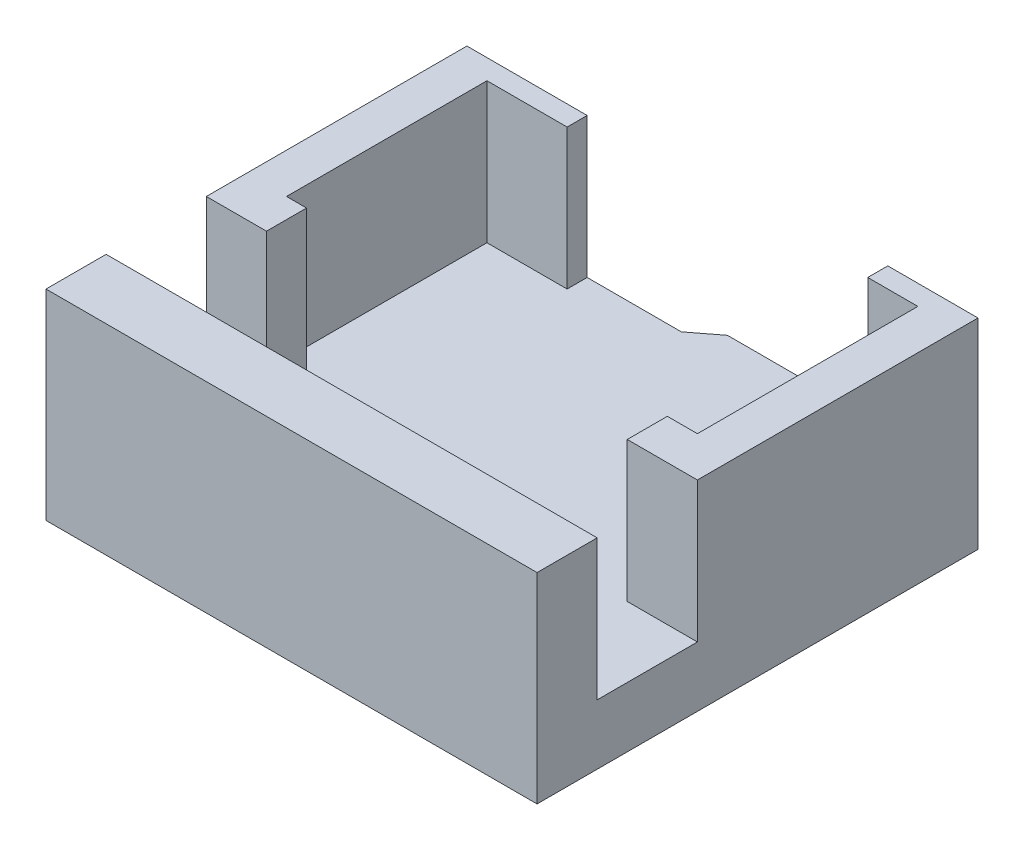
ISO-10303-21;
HEADER;
FILE_DESCRIPTION(('STEP AP214'),'2;1');
FILE_NAME('part.step','',(''),(''),'','','');
FILE_SCHEMA(('AUTOMOTIVE_DESIGN { 1 0 10303 214 1 1 1 1 }'));
ENDSEC;
DATA;
#1=APPLICATION_CONTEXT('core data for automotive mechanical design processes');
#2=APPLICATION_PROTOCOL_DEFINITION('international standard','automotive_design',2000,#1);
#3=PRODUCT_CONTEXT('',#1,'mechanical');
#4=PRODUCT('Part','Part','',(#3));
#5=PRODUCT_RELATED_PRODUCT_CATEGORY('part','',(#4));
#6=PRODUCT_DEFINITION_FORMATION('','',#4);
#7=PRODUCT_DEFINITION_CONTEXT('part definition',#1,'design');
#8=PRODUCT_DEFINITION('design','',#6,#7);
#9=PRODUCT_DEFINITION_SHAPE('','',#8);
#10=(LENGTH_UNIT() NAMED_UNIT(*) SI_UNIT(.MILLI.,.METRE.));
#11=(NAMED_UNIT(*) PLANE_ANGLE_UNIT() SI_UNIT($,.RADIAN.));
#12=(NAMED_UNIT(*) SI_UNIT($,.STERADIAN.) SOLID_ANGLE_UNIT());
#13=UNCERTAINTY_MEASURE_WITH_UNIT(LENGTH_MEASURE(1.E-05),#10,'distance_accuracy_value','');
#14=(GEOMETRIC_REPRESENTATION_CONTEXT(3) GLOBAL_UNCERTAINTY_ASSIGNED_CONTEXT((#13)) GLOBAL_UNIT_ASSIGNED_CONTEXT((#10,
#11,#12)) REPRESENTATION_CONTEXT('',''));
#15=CARTESIAN_POINT('',(0.,0.,0.));
#16=DIRECTION('',(0.,0.,1.));
#17=DIRECTION('',(1.,0.,0.));
#18=AXIS2_PLACEMENT_3D('',#15,#16,#17);
#19=CARTESIAN_POINT('',(0.,0.,0.));
#20=DIRECTION('',(0.,1.,0.));
#21=DIRECTION('',(0.,0.,1.));
#22=AXIS2_PLACEMENT_3D('',#19,#20,#21);
#23=PLANE('',#22);
#24=DIRECTION('',(0.,0.,-1.));
#25=VECTOR('',#24,1.);
#26=CARTESIAN_POINT('',(-40.9720106226123,0.,29.2345729847087));
#27=LINE('',#26,#25);
#28=CARTESIAN_POINT('',(-40.9720106226123,0.,26.2345729847087));
#29=VERTEX_POINT('',#28);
#30=CARTESIAN_POINT('',(-40.9720106226123,0.,21.2345729847087));
#31=VERTEX_POINT('',#30);
#32=EDGE_CURVE('E43',#29,#31,#27,.T.);
#33=ORIENTED_EDGE('',*,*,#32,.F.);
#34=DIRECTION('',(-1.,0.,0.));
#35=VECTOR('',#34,1.);
#36=CARTESIAN_POINT('',(-40.9720106226123,0.,26.2345729847087));
#37=LINE('',#36,#35);
#38=CARTESIAN_POINT('',(-16.4720106226123,0.,26.2345729847087));
#39=VERTEX_POINT('',#38);
#40=EDGE_CURVE('E242',#39,#29,#37,.T.);
#41=ORIENTED_EDGE('',*,*,#40,.F.);
#42=DIRECTION('',(0.,0.,-1.));
#43=VECTOR('',#42,1.);
#44=CARTESIAN_POINT('',(-16.4720106226123,0.,29.2345729847087));
#45=LINE('',#44,#43);
#46=CARTESIAN_POINT('',(-16.4720106226123,0.,21.2345729847087));
#47=VERTEX_POINT('',#46);
#48=EDGE_CURVE('E58',#39,#47,#45,.T.);
#49=ORIENTED_EDGE('',*,*,#48,.T.);
#50=DIRECTION('',(-1.,0.,0.));
#51=VECTOR('',#50,1.);
#52=CARTESIAN_POINT('',(-40.9720106226123,0.,21.2345729847087));
#53=LINE('',#52,#51);
#54=CARTESIAN_POINT('',(-19.9720106226123,0.,21.2345729847087));
#55=VERTEX_POINT('',#54);
#56=EDGE_CURVE('E208',#47,#55,#53,.T.);
#57=ORIENTED_EDGE('',*,*,#56,.T.);
#58=DIRECTION('',(0.,0.,1.));
#59=VECTOR('',#58,1.);
#60=CARTESIAN_POINT('',(-19.9720106226123,0.,19.2345729847087));
#61=LINE('',#60,#59);
#62=CARTESIAN_POINT('',(-19.9720106226123,0.,19.2345729847087));
#63=VERTEX_POINT('',#62);
#64=EDGE_CURVE('E276',#63,#55,#61,.T.);
#65=ORIENTED_EDGE('',*,*,#64,.F.);
#66=DIRECTION('',(-1.,0.,0.));
#67=VECTOR('',#66,1.);
#68=CARTESIAN_POINT('',(-19.9720106226123,0.,19.2345729847087));
#69=LINE('',#68,#67);
#70=CARTESIAN_POINT('',(-18.4720106226124,0.,19.2345729847087));
#71=VERTEX_POINT('',#70);
#72=EDGE_CURVE('E280',#71,#63,#69,.T.);
#73=ORIENTED_EDGE('',*,*,#72,.F.);
#74=DIRECTION('',(0.,0.,1.));
#75=VECTOR('',#74,1.);
#76=CARTESIAN_POINT('',(-18.4720106226124,0.,8.23457298470868));
#77=LINE('',#76,#75);
#78=CARTESIAN_POINT('',(-18.4720106226124,0.,8.23457298470868));
#79=VERTEX_POINT('',#78);
#80=EDGE_CURVE('E297',#79,#71,#77,.T.);
#81=ORIENTED_EDGE('',*,*,#80,.F.);
#82=DIRECTION('',(1.,0.,0.));
#83=VECTOR('',#82,1.);
#84=CARTESIAN_POINT('',(-18.9720106226124,0.,8.23457298470868));
#85=LINE('',#84,#83);
#86=CARTESIAN_POINT('',(-20.9720106226123,0.,8.23457298470868));
#87=VERTEX_POINT('',#86);
#88=EDGE_CURVE('E430',#87,#79,#85,.T.);
#89=ORIENTED_EDGE('',*,*,#88,.F.);
#90=DIRECTION('',(0.,0.,1.));
#91=VECTOR('',#90,1.);
#92=CARTESIAN_POINT('',(-20.9720106226123,0.,8.23457298470868));
#93=LINE('',#92,#91);
#94=CARTESIAN_POINT('',(-20.9720106226123,0.,7.23457298470868));
#95=VERTEX_POINT('',#94);
#96=EDGE_CURVE('E279',#95,#87,#93,.T.);
#97=ORIENTED_EDGE('',*,*,#96,.F.);
#98=DIRECTION('',(1.,0.,0.));
#99=VECTOR('',#98,1.);
#100=CARTESIAN_POINT('',(-16.9720106226123,0.,7.23457298470868));
#101=LINE('',#100,#99);
#102=CARTESIAN_POINT('',(-28.9720106226123,0.,7.23457298470868));
#103=VERTEX_POINT('',#102);
#104=EDGE_CURVE('E414',#103,#95,#101,.T.);
#105=ORIENTED_EDGE('',*,*,#104,.F.);
#106=DIRECTION('',(0.792976419762449,0.,-0.609252326791395));
#107=VECTOR('',#106,1.);
#108=CARTESIAN_POINT('',(-28.9720106226123,0.,7.23457298470868));
#109=LINE('',#108,#107);
#110=CARTESIAN_POINT('',(-30.273567276386,0.,8.23457298470868));
#111=VERTEX_POINT('',#110);
#112=EDGE_CURVE('E406',#111,#103,#109,.T.);
#113=ORIENTED_EDGE('',*,*,#112,.F.);
#114=DIRECTION('',(1.,0.,0.));
#115=VECTOR('',#114,1.);
#116=CARTESIAN_POINT('',(-30.273567276386,0.,8.23457298470868));
#117=LINE('',#116,#115);
#118=CARTESIAN_POINT('',(-34.9720106226123,0.,8.23457298470868));
#119=VERTEX_POINT('',#118);
#120=EDGE_CURVE('E403',#119,#111,#117,.T.);
#121=ORIENTED_EDGE('',*,*,#120,.F.);
#122=DIRECTION('',(0.,0.,-1.));
#123=VECTOR('',#122,1.);
#124=CARTESIAN_POINT('',(-34.9720106226123,0.,9.23457298470868));
#125=LINE('',#124,#123);
#126=CARTESIAN_POINT('',(-34.9720106226123,0.,9.23457298470868));
#127=VERTEX_POINT('',#126);
#128=EDGE_CURVE('E319',#127,#119,#125,.T.);
#129=ORIENTED_EDGE('',*,*,#128,.F.);
#130=DIRECTION('',(1.,0.,0.));
#131=VECTOR('',#130,1.);
#132=CARTESIAN_POINT('',(-38.9720106226124,0.,9.23457298470868));
#133=LINE('',#132,#131);
#134=CARTESIAN_POINT('',(-38.9720106226124,0.,9.23457298470868));
#135=VERTEX_POINT('',#134);
#136=EDGE_CURVE('E339',#135,#127,#133,.T.);
#137=ORIENTED_EDGE('',*,*,#136,.F.);
#138=DIRECTION('',(0.,0.,-1.));
#139=VECTOR('',#138,1.);
#140=CARTESIAN_POINT('',(-38.9720106226124,0.,19.2345729847087));
#141=LINE('',#140,#139);
#142=CARTESIAN_POINT('',(-38.9720106226124,0.,19.2345729847087));
#143=VERTEX_POINT('',#142);
#144=EDGE_CURVE('E374',#143,#135,#141,.T.);
#145=ORIENTED_EDGE('',*,*,#144,.F.);
#146=DIRECTION('',(-1.,0.,0.));
#147=VECTOR('',#146,1.);
#148=CARTESIAN_POINT('',(-38.9720106226124,0.,19.2345729847087));
#149=LINE('',#148,#147);
#150=CARTESIAN_POINT('',(-37.9720106226124,0.,19.2345729847087));
#151=VERTEX_POINT('',#150);
#152=EDGE_CURVE('E314',#151,#143,#149,.T.);
#153=ORIENTED_EDGE('',*,*,#152,.F.);
#154=DIRECTION('',(0.,0.,-1.));
#155=VECTOR('',#154,1.);
#156=CARTESIAN_POINT('',(-37.9720106226124,0.,21.2345729847087));
#157=LINE('',#156,#155);
#158=CARTESIAN_POINT('',(-37.9720106226124,0.,21.2345729847087));
#159=VERTEX_POINT('',#158);
#160=EDGE_CURVE('E311',#159,#151,#157,.T.);
#161=ORIENTED_EDGE('',*,*,#160,.F.);
#162=EDGE_CURVE('E11',#159,#31,#53,.T.);
#163=ORIENTED_EDGE('',*,*,#162,.T.);
#164=EDGE_LOOP('',(#33,#41,#49,#57,#65,#73,#81,#89,#97,#105,#113,#121,#129,#137,#145,#153,#161,#163));
#165=FACE_BOUND('',#164,.T.);
#166=ADVANCED_FACE('F39',(#165),#23,.T.);
#167=CARTESIAN_POINT('',(-40.9720106226123,7.,21.2345729847087));
#168=DIRECTION('',(0.,0.,-1.));
#169=DIRECTION('',(-1.,0.,0.));
#170=AXIS2_PLACEMENT_3D('',#167,#168,#169);
#171=PLANE('',#170);
#172=ORIENTED_EDGE('',*,*,#56,.F.);
#173=DIRECTION('',(0.,-1.,0.));
#174=VECTOR('',#173,1.);
#175=CARTESIAN_POINT('',(-16.4720106226123,-2.,21.2345729847087));
#176=LINE('',#175,#174);
#177=CARTESIAN_POINT('',(-16.4720106226123,7.,21.2345729847087));
#178=VERTEX_POINT('',#177);
#179=EDGE_CURVE('E271',#178,#47,#176,.T.);
#180=ORIENTED_EDGE('',*,*,#179,.F.);
#181=DIRECTION('',(1.,0.,0.));
#182=VECTOR('',#181,1.);
#183=CARTESIAN_POINT('',(-16.9720106226123,7.,21.2345729847087));
#184=LINE('',#183,#182);
#185=CARTESIAN_POINT('',(-19.9720106226123,7.,21.2345729847087));
#186=VERTEX_POINT('',#185);
#187=EDGE_CURVE('E454',#186,#178,#184,.T.);
#188=ORIENTED_EDGE('',*,*,#187,.F.);
#189=DIRECTION('',(0.,-1.,0.));
#190=VECTOR('',#189,1.);
#191=CARTESIAN_POINT('',(-19.9720106226123,7.,21.2345729847087));
#192=LINE('',#191,#190);
#193=EDGE_CURVE('E283',#186,#55,#192,.T.);
#194=ORIENTED_EDGE('',*,*,#193,.T.);
#195=EDGE_LOOP('',(#172,#180,#188,#194));
#196=FACE_BOUND('',#195,.T.);
#197=ADVANCED_FACE('F504',(#196),#171,.F.);
#198=ORIENTED_EDGE('',*,*,#162,.F.);
#199=DIRECTION('',(0.,-1.,0.));
#200=VECTOR('',#199,1.);
#201=CARTESIAN_POINT('',(-37.9720106226124,7.,21.2345729847087));
#202=LINE('',#201,#200);
#203=CARTESIAN_POINT('',(-37.9720106226124,7.,21.2345729847087));
#204=VERTEX_POINT('',#203);
#205=EDGE_CURVE('E309',#204,#159,#202,.T.);
#206=ORIENTED_EDGE('',*,*,#205,.F.);
#207=DIRECTION('',(1.,0.,0.));
#208=VECTOR('',#207,1.);
#209=CARTESIAN_POINT('',(-40.9720106226123,7.,21.2345729847087));
#210=LINE('',#209,#208);
#211=CARTESIAN_POINT('',(-40.9720106226123,7.,21.2345729847087));
#212=VERTEX_POINT('',#211);
#213=EDGE_CURVE('E307',#212,#204,#210,.T.);
#214=ORIENTED_EDGE('',*,*,#213,.F.);
#215=DIRECTION('',(0.,-1.,0.));
#216=VECTOR('',#215,1.);
#217=CARTESIAN_POINT('',(-40.9720106226123,7.,21.2345729847087));
#218=LINE('',#217,#216);
#219=EDGE_CURVE('E301',#212,#31,#218,.T.);
#220=ORIENTED_EDGE('',*,*,#219,.T.);
#221=EDGE_LOOP('',(#198,#206,#214,#220));
#222=FACE_BOUND('',#221,.T.);
#223=ADVANCED_FACE('F304',(#222),#171,.F.);
#224=CARTESIAN_POINT('',(-38.9720106226124,7.,19.2345729847087));
#225=DIRECTION('',(-1.,0.,0.));
#226=DIRECTION('',(0.,0.,1.));
#227=AXIS2_PLACEMENT_3D('',#224,#225,#226);
#228=PLANE('',#227);
#229=ORIENTED_EDGE('',*,*,#144,.T.);
#230=DIRECTION('',(0.,-1.,0.));
#231=VECTOR('',#230,1.);
#232=CARTESIAN_POINT('',(-38.9720106226124,7.,9.23457298470868));
#233=LINE('',#232,#231);
#234=CARTESIAN_POINT('',(-38.9720106226124,7.,9.23457298470868));
#235=VERTEX_POINT('',#234);
#236=EDGE_CURVE('E50',#235,#135,#233,.T.);
#237=ORIENTED_EDGE('',*,*,#236,.F.);
#238=DIRECTION('',(0.,0.,-1.));
#239=VECTOR('',#238,1.);
#240=CARTESIAN_POINT('',(-38.9720106226124,7.,19.2345729847087));
#241=LINE('',#240,#239);
#242=CARTESIAN_POINT('',(-38.9720106226124,7.,19.2345729847087));
#243=VERTEX_POINT('',#242);
#244=EDGE_CURVE('E348',#243,#235,#241,.T.);
#245=ORIENTED_EDGE('',*,*,#244,.F.);
#246=DIRECTION('',(0.,-1.,0.));
#247=VECTOR('',#246,1.);
#248=CARTESIAN_POINT('',(-38.9720106226124,7.,19.2345729847087));
#249=LINE('',#248,#247);
#250=EDGE_CURVE('E328',#243,#143,#249,.T.);
#251=ORIENTED_EDGE('',*,*,#250,.T.);
#252=EDGE_LOOP('',(#229,#237,#245,#251));
#253=FACE_BOUND('',#252,.T.);
#254=ADVANCED_FACE('F41',(#253),#228,.F.);
#255=CARTESIAN_POINT('',(-38.9720106226124,7.,9.23457298470868));
#256=DIRECTION('',(0.,0.,-1.));
#257=DIRECTION('',(-1.,0.,0.));
#258=AXIS2_PLACEMENT_3D('',#255,#256,#257);
#259=PLANE('',#258);
#260=ORIENTED_EDGE('',*,*,#136,.T.);
#261=DIRECTION('',(0.,-1.,0.));
#262=VECTOR('',#261,1.);
#263=CARTESIAN_POINT('',(-34.9720106226123,7.,9.23457298470868));
#264=LINE('',#263,#262);
#265=CARTESIAN_POINT('',(-34.9720106226123,7.,9.23457298470868));
#266=VERTEX_POINT('',#265);
#267=EDGE_CURVE('E358',#266,#127,#264,.T.);
#268=ORIENTED_EDGE('',*,*,#267,.F.);
#269=DIRECTION('',(1.,0.,0.));
#270=VECTOR('',#269,1.);
#271=CARTESIAN_POINT('',(-38.9720106226124,7.,9.23457298470868));
#272=LINE('',#271,#270);
#273=EDGE_CURVE('E370',#235,#266,#272,.T.);
#274=ORIENTED_EDGE('',*,*,#273,.F.);
#275=ORIENTED_EDGE('',*,*,#236,.T.);
#276=EDGE_LOOP('',(#260,#268,#274,#275));
#277=FACE_BOUND('',#276,.T.);
#278=ADVANCED_FACE('F368',(#277),#259,.F.);
#279=CARTESIAN_POINT('',(-34.9720106226123,7.,9.23457298470868));
#280=DIRECTION('',(-1.,0.,0.));
#281=DIRECTION('',(0.,0.,1.));
#282=AXIS2_PLACEMENT_3D('',#279,#280,#281);
#283=PLANE('',#282);
#284=ORIENTED_EDGE('',*,*,#128,.T.);
#285=DIRECTION('',(0.,-1.,0.));
#286=VECTOR('',#285,1.);
#287=CARTESIAN_POINT('',(-34.9720106226123,7.,8.23457298470868));
#288=LINE('',#287,#286);
#289=CARTESIAN_POINT('',(-34.9720106226123,7.,8.23457298470868));
#290=VERTEX_POINT('',#289);
#291=EDGE_CURVE('E340',#290,#119,#288,.T.);
#292=ORIENTED_EDGE('',*,*,#291,.F.);
#293=DIRECTION('',(0.,0.,-1.));
#294=VECTOR('',#293,1.);
#295=CARTESIAN_POINT('',(-34.9720106226123,7.,9.23457298470868));
#296=LINE('',#295,#294);
#297=EDGE_CURVE('E396',#266,#290,#296,.T.);
#298=ORIENTED_EDGE('',*,*,#297,.F.);
#299=ORIENTED_EDGE('',*,*,#267,.T.);
#300=EDGE_LOOP('',(#284,#292,#298,#299));
#301=FACE_BOUND('',#300,.T.);
#302=ADVANCED_FACE('F551',(#301),#283,.F.);
#303=CARTESIAN_POINT('',(-34.9720106226123,7.,8.23457298470868));
#304=DIRECTION('',(0.,0.,1.));
#305=DIRECTION('',(1.,0.,0.));
#306=AXIS2_PLACEMENT_3D('',#303,#304,#305);
#307=PLANE('',#306);
#308=ORIENTED_EDGE('',*,*,#291,.T.);
#309=ORIENTED_EDGE('',*,*,#120,.T.);
#310=DIRECTION('',(0.,1.,0.));
#311=VECTOR('',#310,1.);
#312=CARTESIAN_POINT('',(-30.273567276386,-2.,8.23457298470868));
#313=LINE('',#312,#311);
#314=CARTESIAN_POINT('',(-30.273567276386,-3.,8.23457298470868));
#315=VERTEX_POINT('',#314);
#316=EDGE_CURVE('E377',#315,#111,#313,.T.);
#317=ORIENTED_EDGE('',*,*,#316,.F.);
#318=DIRECTION('',(1.,0.,0.));
#319=VECTOR('',#318,1.);
#320=CARTESIAN_POINT('',(-40.9720106226123,-3.,8.23457298470868));
#321=LINE('',#320,#319);
#322=CARTESIAN_POINT('',(-40.9720106226123,-3.,8.23457298470868));
#323=VERTEX_POINT('',#322);
#324=EDGE_CURVE('E220',#323,#315,#321,.T.);
#325=ORIENTED_EDGE('',*,*,#324,.F.);
#326=DIRECTION('',(0.,-1.,0.));
#327=VECTOR('',#326,1.);
#328=CARTESIAN_POINT('',(-40.9720106226123,7.,8.23457298470868));
#329=LINE('',#328,#327);
#330=CARTESIAN_POINT('',(-40.9720106226123,7.,8.23457298470868));
#331=VERTEX_POINT('',#330);
#332=EDGE_CURVE('E215',#331,#323,#329,.T.);
#333=ORIENTED_EDGE('',*,*,#332,.F.);
#334=DIRECTION('',(-1.,0.,0.));
#335=VECTOR('',#334,1.);
#336=CARTESIAN_POINT('',(-34.9720106226123,7.,8.23457298470868));
#337=LINE('',#336,#335);
#338=EDGE_CURVE('E393',#290,#331,#337,.T.);
#339=ORIENTED_EDGE('',*,*,#338,.F.);
#340=EDGE_LOOP('',(#308,#309,#317,#325,#333,#339));
#341=FACE_BOUND('',#340,.T.);
#342=ADVANCED_FACE('F548',(#341),#307,.F.);
#343=CARTESIAN_POINT('',(-40.9720106226123,7.,8.23457298470868));
#344=DIRECTION('',(1.,0.,0.));
#345=DIRECTION('',(0.,0.,-1.));
#346=AXIS2_PLACEMENT_3D('',#343,#344,#345);
#347=PLANE('',#346);
#348=ORIENTED_EDGE('',*,*,#332,.T.);
#349=DIRECTION('',(0.,0.,-1.));
#350=VECTOR('',#349,1.);
#351=CARTESIAN_POINT('',(-40.9720106226123,-3.,29.2345729847087));
#352=LINE('',#351,#350);
#353=CARTESIAN_POINT('',(-40.9720106226123,-3.,29.2345729847087));
#354=VERTEX_POINT('',#353);
#355=EDGE_CURVE('E211',#354,#323,#352,.T.);
#356=ORIENTED_EDGE('',*,*,#355,.F.);
#357=DIRECTION('',(0.,-1.,0.));
#358=VECTOR('',#357,1.);
#359=CARTESIAN_POINT('',(-40.9720106226123,-2.,29.2345729847087));
#360=LINE('',#359,#358);
#361=CARTESIAN_POINT('',(-40.9720106226123,7.,29.2345729847087));
#362=VERTEX_POINT('',#361);
#363=EDGE_CURVE('E196',#362,#354,#360,.T.);
#364=ORIENTED_EDGE('',*,*,#363,.F.);
#365=DIRECTION('',(0.,0.,1.));
#366=VECTOR('',#365,1.);
#367=CARTESIAN_POINT('',(-40.9720106226123,7.,29.2345729847087));
#368=LINE('',#367,#366);
#369=CARTESIAN_POINT('',(-40.9720106226123,7.,26.2345729847087));
#370=VERTEX_POINT('',#369);
#371=EDGE_CURVE('E254',#370,#362,#368,.T.);
#372=ORIENTED_EDGE('',*,*,#371,.F.);
#373=DIRECTION('',(0.,-1.,0.));
#374=VECTOR('',#373,1.);
#375=CARTESIAN_POINT('',(-40.9720106226123,31.682990094395,26.2345729847087));
#376=LINE('',#375,#374);
#377=EDGE_CURVE('E241',#370,#29,#376,.T.);
#378=ORIENTED_EDGE('',*,*,#377,.T.);
#379=ORIENTED_EDGE('',*,*,#32,.T.);
#380=ORIENTED_EDGE('',*,*,#219,.F.);
#381=DIRECTION('',(0.,0.,1.));
#382=VECTOR('',#381,1.);
#383=CARTESIAN_POINT('',(-40.9720106226123,7.,8.23457298470868));
#384=LINE('',#383,#382);
#385=EDGE_CURVE('E390',#331,#212,#384,.T.);
#386=ORIENTED_EDGE('',*,*,#385,.F.);
#387=EDGE_LOOP('',(#348,#356,#364,#372,#378,#379,#380,#386));
#388=FACE_BOUND('',#387,.T.);
#389=ADVANCED_FACE('F212',(#388),#347,.F.);
#390=CARTESIAN_POINT('',(-37.9720106226124,7.,21.2345729847087));
#391=DIRECTION('',(-1.,0.,0.));
#392=DIRECTION('',(0.,0.,1.));
#393=AXIS2_PLACEMENT_3D('',#390,#391,#392);
#394=PLANE('',#393);
#395=ORIENTED_EDGE('',*,*,#160,.T.);
#396=DIRECTION('',(0.,-1.,0.));
#397=VECTOR('',#396,1.);
#398=CARTESIAN_POINT('',(-37.9720106226124,7.,19.2345729847087));
#399=LINE('',#398,#397);
#400=CARTESIAN_POINT('',(-37.9720106226124,7.,19.2345729847087));
#401=VERTEX_POINT('',#400);
#402=EDGE_CURVE('E325',#401,#151,#399,.T.);
#403=ORIENTED_EDGE('',*,*,#402,.F.);
#404=DIRECTION('',(0.,0.,-1.));
#405=VECTOR('',#404,1.);
#406=CARTESIAN_POINT('',(-37.9720106226124,7.,21.2345729847087));
#407=LINE('',#406,#405);
#408=EDGE_CURVE('E323',#204,#401,#407,.T.);
#409=ORIENTED_EDGE('',*,*,#408,.F.);
#410=ORIENTED_EDGE('',*,*,#205,.T.);
#411=EDGE_LOOP('',(#395,#403,#409,#410));
#412=FACE_BOUND('',#411,.T.);
#413=ADVANCED_FACE('F322',(#412),#394,.F.);
#414=CARTESIAN_POINT('',(-38.9720106226124,7.,19.2345729847087));
#415=DIRECTION('',(0.,0.,1.));
#416=DIRECTION('',(1.,0.,0.));
#417=AXIS2_PLACEMENT_3D('',#414,#415,#416);
#418=PLANE('',#417);
#419=ORIENTED_EDGE('',*,*,#152,.T.);
#420=ORIENTED_EDGE('',*,*,#250,.F.);
#421=DIRECTION('',(-1.,0.,0.));
#422=VECTOR('',#421,1.);
#423=CARTESIAN_POINT('',(-38.9720106226124,7.,19.2345729847087));
#424=LINE('',#423,#422);
#425=EDGE_CURVE('E351',#401,#243,#424,.T.);
#426=ORIENTED_EDGE('',*,*,#425,.F.);
#427=ORIENTED_EDGE('',*,*,#402,.T.);
#428=EDGE_LOOP('',(#419,#420,#426,#427));
#429=FACE_BOUND('',#428,.T.);
#430=ADVANCED_FACE('F539',(#429),#418,.F.);
#431=CARTESIAN_POINT('',(0.,7.,0.));
#432=DIRECTION('',(0.,-1.,0.));
#433=DIRECTION('',(0.,0.,-1.));
#434=AXIS2_PLACEMENT_3D('',#431,#432,#433);
#435=PLANE('',#434);
#436=ORIENTED_EDGE('',*,*,#244,.T.);
#437=ORIENTED_EDGE('',*,*,#273,.T.);
#438=ORIENTED_EDGE('',*,*,#297,.T.);
#439=ORIENTED_EDGE('',*,*,#338,.T.);
#440=ORIENTED_EDGE('',*,*,#385,.T.);
#441=ORIENTED_EDGE('',*,*,#213,.T.);
#442=ORIENTED_EDGE('',*,*,#408,.T.);
#443=ORIENTED_EDGE('',*,*,#425,.T.);
#444=EDGE_LOOP('',(#436,#437,#438,#439,#440,#441,#442,#443));
#445=FACE_BOUND('',#444,.T.);
#446=ADVANCED_FACE('F536',(#445),#435,.F.);
#447=CARTESIAN_POINT('',(-28.9720106226123,-2.,7.23457298470868));
#448=DIRECTION('',(0.609252326791395,0.,0.792976419762449));
#449=DIRECTION('',(0.792976419762449,0.,-0.609252326791395));
#450=AXIS2_PLACEMENT_3D('',#447,#448,#449);
#451=PLANE('',#450);
#452=ORIENTED_EDGE('',*,*,#112,.T.);
#453=DIRECTION('',(0.,1.,0.));
#454=VECTOR('',#453,1.);
#455=CARTESIAN_POINT('',(-28.9720106226123,-2.,7.23457298470868));
#456=LINE('',#455,#454);
#457=CARTESIAN_POINT('',(-28.9720106226123,-3.,7.23457298470868));
#458=VERTEX_POINT('',#457);
#459=EDGE_CURVE('E381',#458,#103,#456,.T.);
#460=ORIENTED_EDGE('',*,*,#459,.F.);
#461=DIRECTION('',(0.792976419762449,0.,-0.609252326791395));
#462=VECTOR('',#461,1.);
#463=CARTESIAN_POINT('',(-30.273567276386,-3.,8.23457298470868));
#464=LINE('',#463,#462);
#465=EDGE_CURVE('E232',#315,#458,#464,.T.);
#466=ORIENTED_EDGE('',*,*,#465,.F.);
#467=ORIENTED_EDGE('',*,*,#316,.T.);
#468=EDGE_LOOP('',(#452,#460,#466,#467));
#469=FACE_BOUND('',#468,.T.);
#470=ADVANCED_FACE('F533',(#469),#451,.F.);
#471=CARTESIAN_POINT('',(-16.9720106226123,-2.,7.23457298470868));
#472=DIRECTION('',(0.,0.,1.));
#473=DIRECTION('',(1.,0.,0.));
#474=AXIS2_PLACEMENT_3D('',#471,#472,#473);
#475=PLANE('',#474);
#476=ORIENTED_EDGE('',*,*,#104,.T.);
#477=DIRECTION('',(0.,-1.,0.));
#478=VECTOR('',#477,1.);
#479=CARTESIAN_POINT('',(-20.9720106226123,7.,7.23457298470868));
#480=LINE('',#479,#478);
#481=CARTESIAN_POINT('',(-20.9720106226123,7.,7.23457298470868));
#482=VERTEX_POINT('',#481);
#483=EDGE_CURVE('E288',#482,#95,#480,.T.);
#484=ORIENTED_EDGE('',*,*,#483,.F.);
#485=DIRECTION('',(-1.,0.,0.));
#486=VECTOR('',#485,1.);
#487=CARTESIAN_POINT('',(-20.9720106226123,7.,7.23457298470868));
#488=LINE('',#487,#486);
#489=CARTESIAN_POINT('',(-16.4720106226123,7.,7.23457298470868));
#490=VERTEX_POINT('',#489);
#491=EDGE_CURVE('E448',#490,#482,#488,.T.);
#492=ORIENTED_EDGE('',*,*,#491,.F.);
#493=DIRECTION('',(0.,1.,0.));
#494=VECTOR('',#493,1.);
#495=CARTESIAN_POINT('',(-16.4720106226123,-2.,7.23457298470868));
#496=LINE('',#495,#494);
#497=CARTESIAN_POINT('',(-16.4720106226123,-3.,7.23457298470868));
#498=VERTEX_POINT('',#497);
#499=EDGE_CURVE('E451',#498,#490,#496,.T.);
#500=ORIENTED_EDGE('',*,*,#499,.F.);
#501=DIRECTION('',(1.,0.,0.));
#502=VECTOR('',#501,1.);
#503=CARTESIAN_POINT('',(-28.9720106226123,-3.,7.23457298470868));
#504=LINE('',#503,#502);
#505=EDGE_CURVE('E236',#458,#498,#504,.T.);
#506=ORIENTED_EDGE('',*,*,#505,.F.);
#507=ORIENTED_EDGE('',*,*,#459,.T.);
#508=EDGE_LOOP('',(#476,#484,#492,#500,#506,#507));
#509=FACE_BOUND('',#508,.T.);
#510=ADVANCED_FACE('F422',(#509),#475,.F.);
#511=CARTESIAN_POINT('',(-19.9720106226123,7.,19.2345729847087));
#512=DIRECTION('',(0.,0.,1.));
#513=DIRECTION('',(1.,0.,0.));
#514=AXIS2_PLACEMENT_3D('',#511,#512,#513);
#515=PLANE('',#514);
#516=ORIENTED_EDGE('',*,*,#72,.T.);
#517=DIRECTION('',(0.,-1.,0.));
#518=VECTOR('',#517,1.);
#519=CARTESIAN_POINT('',(-19.9720106226123,7.,19.2345729847087));
#520=LINE('',#519,#518);
#521=CARTESIAN_POINT('',(-19.9720106226123,7.,19.2345729847087));
#522=VERTEX_POINT('',#521);
#523=EDGE_CURVE('E287',#522,#63,#520,.T.);
#524=ORIENTED_EDGE('',*,*,#523,.F.);
#525=DIRECTION('',(-1.,0.,0.));
#526=VECTOR('',#525,1.);
#527=CARTESIAN_POINT('',(-19.9720106226123,7.,19.2345729847087));
#528=LINE('',#527,#526);
#529=CARTESIAN_POINT('',(-18.4720106226124,7.,19.2345729847087));
#530=VERTEX_POINT('',#529);
#531=EDGE_CURVE('E66',#530,#522,#528,.T.);
#532=ORIENTED_EDGE('',*,*,#531,.F.);
#533=DIRECTION('',(0.,1.,0.));
#534=VECTOR('',#533,1.);
#535=CARTESIAN_POINT('',(-18.4720106226124,7.,19.2345729847087));
#536=LINE('',#535,#534);
#537=EDGE_CURVE('E471',#71,#530,#536,.T.);
#538=ORIENTED_EDGE('',*,*,#537,.F.);
#539=EDGE_LOOP('',(#516,#524,#532,#538));
#540=FACE_BOUND('',#539,.T.);
#541=ADVANCED_FACE('F497',(#540),#515,.F.);
#542=CARTESIAN_POINT('',(-19.9720106226123,7.,19.2345729847087));
#543=DIRECTION('',(1.,0.,0.));
#544=DIRECTION('',(0.,0.,-1.));
#545=AXIS2_PLACEMENT_3D('',#542,#543,#544);
#546=PLANE('',#545);
#547=ORIENTED_EDGE('',*,*,#64,.T.);
#548=ORIENTED_EDGE('',*,*,#193,.F.);
#549=DIRECTION('',(0.,0.,1.));
#550=VECTOR('',#549,1.);
#551=CARTESIAN_POINT('',(-19.9720106226123,7.,19.2345729847087));
#552=LINE('',#551,#550);
#553=EDGE_CURVE('E478',#522,#186,#552,.T.);
#554=ORIENTED_EDGE('',*,*,#553,.F.);
#555=ORIENTED_EDGE('',*,*,#523,.T.);
#556=EDGE_LOOP('',(#547,#548,#554,#555));
#557=FACE_BOUND('',#556,.T.);
#558=ADVANCED_FACE('F502',(#557),#546,.F.);
#559=CARTESIAN_POINT('',(-20.9720106226123,7.,8.23457298470868));
#560=DIRECTION('',(1.,0.,0.));
#561=DIRECTION('',(0.,0.,-1.));
#562=AXIS2_PLACEMENT_3D('',#559,#560,#561);
#563=PLANE('',#562);
#564=ORIENTED_EDGE('',*,*,#96,.T.);
#565=DIRECTION('',(0.,-1.,0.));
#566=VECTOR('',#565,1.);
#567=CARTESIAN_POINT('',(-20.9720106226123,7.,8.23457298470868));
#568=LINE('',#567,#566);
#569=CARTESIAN_POINT('',(-20.9720106226123,7.,8.23457298470868));
#570=VERTEX_POINT('',#569);
#571=EDGE_CURVE('E441',#570,#87,#568,.T.);
#572=ORIENTED_EDGE('',*,*,#571,.F.);
#573=DIRECTION('',(0.,0.,1.));
#574=VECTOR('',#573,1.);
#575=CARTESIAN_POINT('',(-20.9720106226123,7.,8.23457298470868));
#576=LINE('',#575,#574);
#577=EDGE_CURVE('E447',#482,#570,#576,.T.);
#578=ORIENTED_EDGE('',*,*,#577,.F.);
#579=ORIENTED_EDGE('',*,*,#483,.T.);
#580=EDGE_LOOP('',(#564,#572,#578,#579));
#581=FACE_BOUND('',#580,.T.);
#582=ADVANCED_FACE('F446',(#581),#563,.F.);
#583=CARTESIAN_POINT('',(-18.9720106226124,7.,8.23457298470868));
#584=DIRECTION('',(0.,0.,-1.));
#585=DIRECTION('',(-1.,0.,0.));
#586=AXIS2_PLACEMENT_3D('',#583,#584,#585);
#587=PLANE('',#586);
#588=ORIENTED_EDGE('',*,*,#88,.T.);
#589=DIRECTION('',(0.,-1.,0.));
#590=VECTOR('',#589,1.);
#591=CARTESIAN_POINT('',(-18.4720106226124,7.,8.23457298470868));
#592=LINE('',#591,#590);
#593=CARTESIAN_POINT('',(-18.4720106226124,7.,8.23457298470868));
#594=VERTEX_POINT('',#593);
#595=EDGE_CURVE('E293',#594,#79,#592,.T.);
#596=ORIENTED_EDGE('',*,*,#595,.F.);
#597=DIRECTION('',(1.,0.,0.));
#598=VECTOR('',#597,1.);
#599=CARTESIAN_POINT('',(-18.9720106226124,7.,8.23457298470868));
#600=LINE('',#599,#598);
#601=EDGE_CURVE('E443',#570,#594,#600,.T.);
#602=ORIENTED_EDGE('',*,*,#601,.F.);
#603=ORIENTED_EDGE('',*,*,#571,.T.);
#604=EDGE_LOOP('',(#588,#596,#602,#603));
#605=FACE_BOUND('',#604,.T.);
#606=ADVANCED_FACE('F489',(#605),#587,.F.);
#607=CARTESIAN_POINT('',(0.,7.,0.));
#608=DIRECTION('',(0.,1.,0.));
#609=DIRECTION('',(0.,0.,1.));
#610=AXIS2_PLACEMENT_3D('',#607,#608,#609);
#611=PLANE('',#610);
#612=ORIENTED_EDGE('',*,*,#601,.T.);
#613=DIRECTION('',(0.,0.,-1.));
#614=VECTOR('',#613,1.);
#615=CARTESIAN_POINT('',(-18.4720106226124,7.,8.23457298470868));
#616=LINE('',#615,#614);
#617=EDGE_CURVE('E467',#530,#594,#616,.T.);
#618=ORIENTED_EDGE('',*,*,#617,.F.);
#619=ORIENTED_EDGE('',*,*,#531,.T.);
#620=ORIENTED_EDGE('',*,*,#553,.T.);
#621=ORIENTED_EDGE('',*,*,#187,.T.);
#622=DIRECTION('',(0.,0.,1.));
#623=VECTOR('',#622,1.);
#624=CARTESIAN_POINT('',(-16.4720106226123,7.,7.23457298470868));
#625=LINE('',#624,#623);
#626=EDGE_CURVE('E457',#490,#178,#625,.T.);
#627=ORIENTED_EDGE('',*,*,#626,.F.);
#628=ORIENTED_EDGE('',*,*,#491,.T.);
#629=ORIENTED_EDGE('',*,*,#577,.T.);
#630=EDGE_LOOP('',(#612,#618,#619,#620,#621,#627,#628,#629));
#631=FACE_BOUND('',#630,.T.);
#632=ADVANCED_FACE('F458',(#631),#611,.T.);
#633=CARTESIAN_POINT('',(-16.4720106226123,0.,0.));
#634=DIRECTION('',(1.,0.,0.));
#635=DIRECTION('',(0.,0.,-1.));
#636=AXIS2_PLACEMENT_3D('',#633,#634,#635);
#637=PLANE('',#636);
#638=ORIENTED_EDGE('',*,*,#499,.T.);
#639=ORIENTED_EDGE('',*,*,#626,.T.);
#640=ORIENTED_EDGE('',*,*,#179,.T.);
#641=ORIENTED_EDGE('',*,*,#48,.F.);
#642=DIRECTION('',(0.,-1.,0.));
#643=VECTOR('',#642,1.);
#644=CARTESIAN_POINT('',(-16.4720106226123,31.682990094395,26.2345729847087));
#645=LINE('',#644,#643);
#646=CARTESIAN_POINT('',(-16.4720106226123,7.,26.2345729847087));
#647=VERTEX_POINT('',#646);
#648=EDGE_CURVE('E247',#647,#39,#645,.T.);
#649=ORIENTED_EDGE('',*,*,#648,.F.);
#650=DIRECTION('',(0.,0.,-1.));
#651=VECTOR('',#650,1.);
#652=CARTESIAN_POINT('',(-16.4720106226123,7.,29.2345729847087));
#653=LINE('',#652,#651);
#654=CARTESIAN_POINT('',(-16.4720106226123,7.,29.2345729847087));
#655=VERTEX_POINT('',#654);
#656=EDGE_CURVE('E248',#655,#647,#653,.T.);
#657=ORIENTED_EDGE('',*,*,#656,.F.);
#658=DIRECTION('',(0.,1.,0.));
#659=VECTOR('',#658,1.);
#660=CARTESIAN_POINT('',(-16.4720106226123,-2.,29.2345729847087));
#661=LINE('',#660,#659);
#662=CARTESIAN_POINT('',(-16.4720106226123,-3.,29.2345729847087));
#663=VERTEX_POINT('',#662);
#664=EDGE_CURVE('E207',#663,#655,#661,.T.);
#665=ORIENTED_EDGE('',*,*,#664,.F.);
#666=DIRECTION('',(0.,0.,1.));
#667=VECTOR('',#666,1.);
#668=CARTESIAN_POINT('',(-16.4720106226123,-3.,7.23457298470868));
#669=LINE('',#668,#667);
#670=EDGE_CURVE('E226',#498,#663,#669,.T.);
#671=ORIENTED_EDGE('',*,*,#670,.F.);
#672=EDGE_LOOP('',(#638,#639,#640,#641,#649,#657,#665,#671));
#673=FACE_BOUND('',#672,.T.);
#674=ADVANCED_FACE('F465',(#673),#637,.T.);
#675=CARTESIAN_POINT('',(-18.4720106226124,0.,0.));
#676=DIRECTION('',(-1.,0.,0.));
#677=DIRECTION('',(0.,0.,1.));
#678=AXIS2_PLACEMENT_3D('',#675,#676,#677);
#679=PLANE('',#678);
#680=ORIENTED_EDGE('',*,*,#595,.T.);
#681=ORIENTED_EDGE('',*,*,#80,.T.);
#682=ORIENTED_EDGE('',*,*,#537,.T.);
#683=ORIENTED_EDGE('',*,*,#617,.T.);
#684=EDGE_LOOP('',(#680,#681,#682,#683));
#685=FACE_BOUND('',#684,.T.);
#686=ADVANCED_FACE('F492',(#685),#679,.T.);
#687=CARTESIAN_POINT('',(0.,0.,29.2345729847087));
#688=DIRECTION('',(0.,0.,-1.));
#689=DIRECTION('',(-1.,0.,0.));
#690=AXIS2_PLACEMENT_3D('',#687,#688,#689);
#691=PLANE('',#690);
#692=ORIENTED_EDGE('',*,*,#363,.T.);
#693=DIRECTION('',(-1.,0.,0.));
#694=VECTOR('',#693,1.);
#695=CARTESIAN_POINT('',(-16.4720106226123,-3.,29.2345729847087));
#696=LINE('',#695,#694);
#697=EDGE_CURVE('E200',#663,#354,#696,.T.);
#698=ORIENTED_EDGE('',*,*,#697,.F.);
#699=ORIENTED_EDGE('',*,*,#664,.T.);
#700=DIRECTION('',(1.,0.,0.));
#701=VECTOR('',#700,1.);
#702=CARTESIAN_POINT('',(-40.9720106226123,7.,29.2345729847087));
#703=LINE('',#702,#701);
#704=EDGE_CURVE('E202',#362,#655,#703,.T.);
#705=ORIENTED_EDGE('',*,*,#704,.F.);
#706=EDGE_LOOP('',(#692,#698,#699,#705));
#707=FACE_BOUND('',#706,.T.);
#708=ADVANCED_FACE('F198',(#707),#691,.F.);
#709=CARTESIAN_POINT('',(-40.9720106226123,31.682990094395,26.2345729847087));
#710=DIRECTION('',(0.,0.,1.));
#711=DIRECTION('',(1.,0.,0.));
#712=AXIS2_PLACEMENT_3D('',#709,#710,#711);
#713=PLANE('',#712);
#714=DIRECTION('',(-1.,0.,0.));
#715=VECTOR('',#714,1.);
#716=CARTESIAN_POINT('',(-40.9720106226123,7.,26.2345729847087));
#717=LINE('',#716,#715);
#718=EDGE_CURVE('E246',#647,#370,#717,.T.);
#719=ORIENTED_EDGE('',*,*,#718,.F.);
#720=ORIENTED_EDGE('',*,*,#648,.T.);
#721=ORIENTED_EDGE('',*,*,#40,.T.);
#722=ORIENTED_EDGE('',*,*,#377,.F.);
#723=EDGE_LOOP('',(#719,#720,#721,#722));
#724=FACE_BOUND('',#723,.T.);
#725=ADVANCED_FACE('F509',(#724),#713,.F.);
#726=CARTESIAN_POINT('',(0.,7.,0.));
#727=DIRECTION('',(0.,1.,0.));
#728=DIRECTION('',(0.,0.,1.));
#729=AXIS2_PLACEMENT_3D('',#726,#727,#728);
#730=PLANE('',#729);
#731=ORIENTED_EDGE('',*,*,#718,.T.);
#732=ORIENTED_EDGE('',*,*,#371,.T.);
#733=ORIENTED_EDGE('',*,*,#704,.T.);
#734=ORIENTED_EDGE('',*,*,#656,.T.);
#735=EDGE_LOOP('',(#731,#732,#733,#734));
#736=FACE_BOUND('',#735,.T.);
#737=ADVANCED_FACE('F511',(#736),#730,.T.);
#738=CARTESIAN_POINT('',(0.,-3.,0.));
#739=DIRECTION('',(0.,-1.,0.));
#740=DIRECTION('',(0.,0.,-1.));
#741=AXIS2_PLACEMENT_3D('',#738,#739,#740);
#742=PLANE('',#741);
#743=ORIENTED_EDGE('',*,*,#697,.T.);
#744=ORIENTED_EDGE('',*,*,#355,.T.);
#745=ORIENTED_EDGE('',*,*,#324,.T.);
#746=ORIENTED_EDGE('',*,*,#465,.T.);
#747=ORIENTED_EDGE('',*,*,#505,.T.);
#748=ORIENTED_EDGE('',*,*,#670,.T.);
#749=EDGE_LOOP('',(#743,#744,#745,#746,#747,#748));
#750=FACE_BOUND('',#749,.T.);
#751=ADVANCED_FACE('F223',(#750),#742,.T.);
#752=CLOSED_SHELL('',(#166,#197,#223,#254,#278,#302,#342,#389,#413,#430,#446,#470,#510,#541,
#558,#582,#606,#632,#674,#686,#708,#725,#737,#751));
#753=MANIFOLD_SOLID_BREP('B2',#752);
#754=ADVANCED_BREP_SHAPE_REPRESENTATION('',(#18,#753),#14);
#755=SHAPE_DEFINITION_REPRESENTATION(#9,#754);
ENDSEC;
END-ISO-10303-21;
